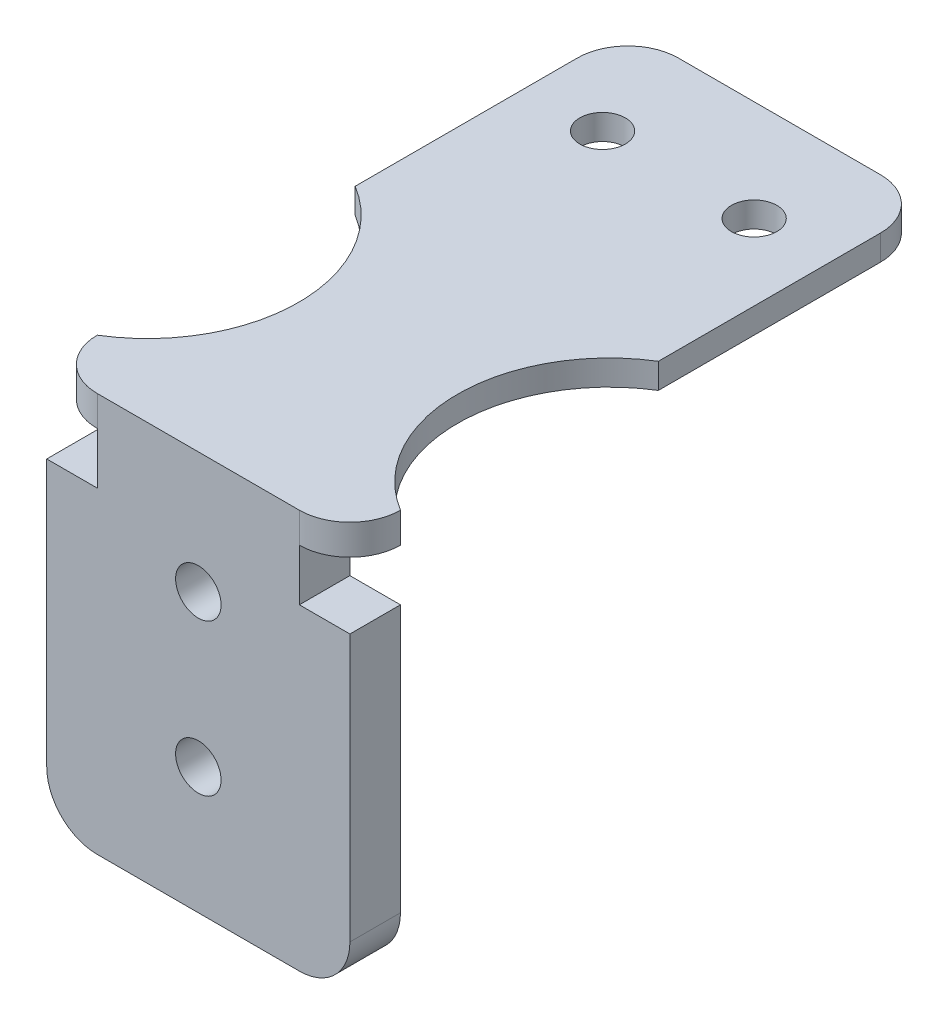
ISO-10303-21;
HEADER;
FILE_DESCRIPTION(('STEP AP214'),'2;1');
FILE_NAME('part.step','',(''),(''),'','','');
FILE_SCHEMA(('AUTOMOTIVE_DESIGN { 1 0 10303 214 1 1 1 1 }'));
ENDSEC;
DATA;
#1=APPLICATION_CONTEXT('core data for automotive mechanical design processes');
#2=APPLICATION_PROTOCOL_DEFINITION('international standard','automotive_design',2000,#1);
#3=PRODUCT_CONTEXT('',#1,'mechanical');
#4=PRODUCT('Part','Part','',(#3));
#5=PRODUCT_RELATED_PRODUCT_CATEGORY('part','',(#4));
#6=PRODUCT_DEFINITION_FORMATION('','',#4);
#7=PRODUCT_DEFINITION_CONTEXT('part definition',#1,'design');
#8=PRODUCT_DEFINITION('design','',#6,#7);
#9=PRODUCT_DEFINITION_SHAPE('','',#8);
#10=(LENGTH_UNIT() NAMED_UNIT(*) SI_UNIT(.MILLI.,.METRE.));
#11=(NAMED_UNIT(*) PLANE_ANGLE_UNIT() SI_UNIT($,.RADIAN.));
#12=(NAMED_UNIT(*) SI_UNIT($,.STERADIAN.) SOLID_ANGLE_UNIT());
#13=UNCERTAINTY_MEASURE_WITH_UNIT(LENGTH_MEASURE(1.E-05),#10,'distance_accuracy_value','');
#14=(GEOMETRIC_REPRESENTATION_CONTEXT(3) GLOBAL_UNCERTAINTY_ASSIGNED_CONTEXT((#13)) GLOBAL_UNIT_ASSIGNED_CONTEXT((#10,
#11,#12)) REPRESENTATION_CONTEXT('',''));
#15=CARTESIAN_POINT('',(0.,0.,0.));
#16=DIRECTION('',(0.,0.,1.));
#17=DIRECTION('',(1.,0.,0.));
#18=AXIS2_PLACEMENT_3D('',#15,#16,#17);
#19=CARTESIAN_POINT('',(-7.84547621701982,-6.78006252951093,16.25));
#20=DIRECTION('',(1.,0.,0.));
#21=DIRECTION('',(0.,0.,-1.));
#22=AXIS2_PLACEMENT_3D('',#19,#20,#21);
#23=PLANE('',#22);
#24=DIRECTION('',(0.,0.888083167154109,-0.459682812619232));
#25=VECTOR('',#24,1.);
#26=CARTESIAN_POINT('',(-7.84547621701982,-2.69769684833897,24.1369171178247));
#27=LINE('',#26,#25);
#28=CARTESIAN_POINT('',(-7.84547621701982,-4.84811479778285,25.25));
#29=VERTEX_POINT('',#28);
#30=CARTESIAN_POINT('',(-7.84547621701982,-3.717189071548,24.6646188803859));
#31=VERTEX_POINT('',#30);
#32=EDGE_CURVE('E211',#29,#31,#27,.T.);
#33=ORIENTED_EDGE('',*,*,#32,.F.);
#34=DIRECTION('',(0.,1.,0.));
#35=VECTOR('',#34,1.);
#36=CARTESIAN_POINT('',(-7.84547621701982,0.,25.25));
#37=LINE('',#36,#35);
#38=CARTESIAN_POINT('',(-7.84547621701982,0.,25.25));
#39=VERTEX_POINT('',#38);
#40=EDGE_CURVE('E440',#29,#39,#37,.T.);
#41=ORIENTED_EDGE('',*,*,#40,.T.);
#42=DIRECTION('',(0.,0.,1.));
#43=VECTOR('',#42,1.);
#44=CARTESIAN_POINT('',(-7.84547621701982,0.,16.25));
#45=LINE('',#44,#43);
#46=CARTESIAN_POINT('',(-7.84547621701982,0.,16.25));
#47=VERTEX_POINT('',#46);
#48=EDGE_CURVE('E231',#47,#39,#45,.T.);
#49=ORIENTED_EDGE('',*,*,#48,.F.);
#50=CARTESIAN_POINT('',(-7.84547621701982,23.9170463435401,31.8437943126175));
#51=DIRECTION('',(1.,0.,0.));
#52=DIRECTION('',(0.,0.,-1.));
#53=AXIS2_PLACEMENT_3D('',#50,#51,#52);
#54=CIRCLE('',#53,28.5515590968912);
#55=EDGE_CURVE('E224',#31,#47,#54,.T.);
#56=ORIENTED_EDGE('',*,*,#55,.F.);
#57=EDGE_LOOP('',(#33,#41,#49,#56));
#58=FACE_BOUND('',#57,.T.);
#59=ADVANCED_FACE('F41',(#58),#23,.F.);
#60=CARTESIAN_POINT('',(7.84547621701982,-6.78006252951093,16.25));
#61=DIRECTION('',(-1.,0.,0.));
#62=DIRECTION('',(0.,0.,1.));
#63=AXIS2_PLACEMENT_3D('',#60,#61,#62);
#64=PLANE('',#63);
#65=DIRECTION('',(0.,0.,1.));
#66=VECTOR('',#65,1.);
#67=CARTESIAN_POINT('',(7.84547621701982,0.,16.25));
#68=LINE('',#67,#66);
#69=CARTESIAN_POINT('',(7.84547621701982,0.,16.25));
#70=VERTEX_POINT('',#69);
#71=CARTESIAN_POINT('',(7.84547621701982,0.,25.25));
#72=VERTEX_POINT('',#71);
#73=EDGE_CURVE('E238',#70,#72,#68,.T.);
#74=ORIENTED_EDGE('',*,*,#73,.T.);
#75=DIRECTION('',(0.,-1.,0.));
#76=VECTOR('',#75,1.);
#77=CARTESIAN_POINT('',(7.84547621701982,-6.78006252951093,25.25));
#78=LINE('',#77,#76);
#79=CARTESIAN_POINT('',(7.84547621701982,-4.84811479778285,25.25));
#80=VERTEX_POINT('',#79);
#81=EDGE_CURVE('E429',#72,#80,#78,.T.);
#82=ORIENTED_EDGE('',*,*,#81,.T.);
#83=DIRECTION('',(0.,-0.888083167154109,0.459682812619232));
#84=VECTOR('',#83,1.);
#85=CARTESIAN_POINT('',(7.84547621701982,-2.69769684833897,24.1369171178247));
#86=LINE('',#85,#84);
#87=CARTESIAN_POINT('',(7.84547621701982,-3.717189071548,24.6646188803859));
#88=VERTEX_POINT('',#87);
#89=EDGE_CURVE('E220',#88,#80,#86,.T.);
#90=ORIENTED_EDGE('',*,*,#89,.F.);
#91=CARTESIAN_POINT('',(7.84547621701982,23.9170463435401,31.8437943126175));
#92=DIRECTION('',(-1.,0.,0.));
#93=DIRECTION('',(0.,0.,1.));
#94=AXIS2_PLACEMENT_3D('',#91,#92,#93);
#95=CIRCLE('',#94,28.5515590968912);
#96=EDGE_CURVE('E227',#70,#88,#95,.T.);
#97=ORIENTED_EDGE('',*,*,#96,.F.);
#98=EDGE_LOOP('',(#74,#82,#90,#97));
#99=FACE_BOUND('',#98,.T.);
#100=ADVANCED_FACE('F514',(#99),#64,.F.);
#101=CARTESIAN_POINT('',(-22.8050965549998,0.,13.4879191185906));
#102=DIRECTION('',(0.,1.,0.));
#103=DIRECTION('',(0.,0.,1.));
#104=AXIS2_PLACEMENT_3D('',#101,#102,#103);
#105=PLANE('',#104);
#106=CARTESIAN_POINT('',(7.50000000000001,0.,-16.25));
#107=DIRECTION('',(0.,1.,0.));
#108=DIRECTION('',(0.,0.,1.));
#109=AXIS2_PLACEMENT_3D('',#106,#107,#108);
#110=CIRCLE('',#109,2.25);
#111=CARTESIAN_POINT('',(7.50000000000001,0.,-14.));
#112=VERTEX_POINT('',#111);
#113=EDGE_CURVE('E360',#112,#112,#110,.T.);
#114=ORIENTED_EDGE('',*,*,#113,.T.);
#115=EDGE_LOOP('',(#114));
#116=FACE_BOUND('',#115,.T.);
#117=CARTESIAN_POINT('',(-7.49999999999999,0.,-16.25));
#118=DIRECTION('',(0.,1.,0.));
#119=DIRECTION('',(0.,0.,1.));
#120=AXIS2_PLACEMENT_3D('',#117,#118,#119);
#121=CIRCLE('',#120,2.25);
#122=CARTESIAN_POINT('',(-7.49999999999999,0.,-14.));
#123=VERTEX_POINT('',#122);
#124=EDGE_CURVE('E364',#123,#123,#121,.T.);
#125=ORIENTED_EDGE('',*,*,#124,.T.);
#126=EDGE_LOOP('',(#125));
#127=FACE_BOUND('',#126,.T.);
#128=DIRECTION('',(1.,0.,0.));
#129=VECTOR('',#128,1.);
#130=CARTESIAN_POINT('',(-15.,0.,26.25));
#131=LINE('',#130,#129);
#132=CARTESIAN_POINT('',(8.84547621701982,0.,26.25));
#133=VERTEX_POINT('',#132);
#134=CARTESIAN_POINT('',(15.,0.,26.25));
#135=VERTEX_POINT('',#134);
#136=EDGE_CURVE('E391',#133,#135,#131,.T.);
#137=ORIENTED_EDGE('',*,*,#136,.F.);
#138=CARTESIAN_POINT('',(8.84547621701982,0.,25.25));
#139=DIRECTION('',(0.,1.,0.));
#140=DIRECTION('',(0.,0.,1.));
#141=AXIS2_PLACEMENT_3D('',#138,#139,#140);
#142=CIRCLE('',#141,1.);
#143=EDGE_CURVE('E438',#133,#72,#142,.F.);
#144=ORIENTED_EDGE('',*,*,#143,.T.);
#145=ORIENTED_EDGE('',*,*,#73,.F.);
#146=DIRECTION('',(1.,0.,0.));
#147=VECTOR('',#146,1.);
#148=CARTESIAN_POINT('',(7.84547621701982,0.,16.25));
#149=LINE('',#148,#147);
#150=EDGE_CURVE('E236',#47,#70,#149,.T.);
#151=ORIENTED_EDGE('',*,*,#150,.F.);
#152=ORIENTED_EDGE('',*,*,#48,.T.);
#153=CARTESIAN_POINT('',(-8.84547621701982,0.,25.25));
#154=DIRECTION('',(0.,1.,0.));
#155=DIRECTION('',(0.,0.,1.));
#156=AXIS2_PLACEMENT_3D('',#153,#154,#155);
#157=CIRCLE('',#156,1.);
#158=CARTESIAN_POINT('',(-8.84547621701982,0.,26.25));
#159=VERTEX_POINT('',#158);
#160=EDGE_CURVE('E62',#39,#159,#157,.F.);
#161=ORIENTED_EDGE('',*,*,#160,.T.);
#162=CARTESIAN_POINT('',(-15.,0.,26.25));
#163=VERTEX_POINT('',#162);
#164=EDGE_CURVE('E392',#163,#159,#131,.T.);
#165=ORIENTED_EDGE('',*,*,#164,.F.);
#166=CARTESIAN_POINT('',(-22.8050965549998,0.,13.4879191185906));
#167=DIRECTION('',(0.,-1.,0.));
#168=DIRECTION('',(0.,0.,1.));
#169=AXIS2_PLACEMENT_3D('',#166,#167,#168);
#170=CIRCLE('',#169,14.95962033798);
#171=CARTESIAN_POINT('',(-15.,0.,0.725838237181253));
#172=VERTEX_POINT('',#171);
#173=EDGE_CURVE('E370',#172,#163,#170,.T.);
#174=ORIENTED_EDGE('',*,*,#173,.F.);
#175=DIRECTION('',(0.,0.,1.));
#176=VECTOR('',#175,1.);
#177=CARTESIAN_POINT('',(-15.,0.,-21.25));
#178=LINE('',#177,#176);
#179=CARTESIAN_POINT('',(-15.,0.,-21.25));
#180=VERTEX_POINT('',#179);
#181=EDGE_CURVE('E377',#180,#172,#178,.T.);
#182=ORIENTED_EDGE('',*,*,#181,.F.);
#183=CARTESIAN_POINT('',(-10.,0.,-21.25));
#184=DIRECTION('',(0.,1.,0.));
#185=DIRECTION('',(0.,0.,-1.));
#186=AXIS2_PLACEMENT_3D('',#183,#184,#185);
#187=CIRCLE('',#186,5.);
#188=CARTESIAN_POINT('',(-10.,0.,-26.25));
#189=VERTEX_POINT('',#188);
#190=EDGE_CURVE('E403',#189,#180,#187,.T.);
#191=ORIENTED_EDGE('',*,*,#190,.F.);
#192=DIRECTION('',(-1.,0.,0.));
#193=VECTOR('',#192,1.);
#194=CARTESIAN_POINT('',(-10.,0.,-26.25));
#195=LINE('',#194,#193);
#196=CARTESIAN_POINT('',(10.,0.,-26.25));
#197=VERTEX_POINT('',#196);
#198=EDGE_CURVE('E401',#197,#189,#195,.T.);
#199=ORIENTED_EDGE('',*,*,#198,.F.);
#200=CARTESIAN_POINT('',(10.,0.,-21.25));
#201=DIRECTION('',(0.,1.,0.));
#202=DIRECTION('',(0.,0.,-1.));
#203=AXIS2_PLACEMENT_3D('',#200,#201,#202);
#204=CIRCLE('',#203,5.);
#205=CARTESIAN_POINT('',(15.,0.,-21.25));
#206=VERTEX_POINT('',#205);
#207=EDGE_CURVE('E399',#206,#197,#204,.T.);
#208=ORIENTED_EDGE('',*,*,#207,.F.);
#209=DIRECTION('',(0.,0.,-1.));
#210=VECTOR('',#209,1.);
#211=CARTESIAN_POINT('',(15.,0.,-21.25));
#212=LINE('',#211,#210);
#213=CARTESIAN_POINT('',(15.,0.,0.725838237181253));
#214=VERTEX_POINT('',#213);
#215=EDGE_CURVE('E397',#214,#206,#212,.T.);
#216=ORIENTED_EDGE('',*,*,#215,.F.);
#217=CARTESIAN_POINT('',(22.8863703515131,0.,13.4879191185906));
#218=DIRECTION('',(0.,-1.,0.));
#219=DIRECTION('',(0.,0.,-1.));
#220=AXIS2_PLACEMENT_3D('',#217,#218,#219);
#221=CIRCLE('',#220,15.002184699065);
#222=EDGE_CURVE('E395',#135,#214,#221,.T.);
#223=ORIENTED_EDGE('',*,*,#222,.F.);
#224=EDGE_LOOP('',(#137,#144,#145,#151,#152,#161,#165,#174,#182,#191,#199,#208,#216,#223));
#225=FACE_BOUND('',#224,.T.);
#226=ADVANCED_FACE('F452',(#116,#127,#225),#105,.F.);
#227=CARTESIAN_POINT('',(0.,0.,26.25));
#228=DIRECTION('',(0.,0.,1.));
#229=DIRECTION('',(1.,0.,0.));
#230=AXIS2_PLACEMENT_3D('',#227,#228,#229);
#231=PLANE('',#230);
#232=CARTESIAN_POINT('',(0.,-9.5,26.25));
#233=DIRECTION('',(0.,0.,1.));
#234=DIRECTION('',(1.,0.,0.));
#235=AXIS2_PLACEMENT_3D('',#232,#233,#234);
#236=CIRCLE('',#235,2.25);
#237=CARTESIAN_POINT('',(2.25,-9.5,26.25));
#238=VERTEX_POINT('',#237);
#239=EDGE_CURVE('E314',#238,#238,#236,.T.);
#240=ORIENTED_EDGE('',*,*,#239,.T.);
#241=EDGE_LOOP('',(#240));
#242=FACE_BOUND('',#241,.T.);
#243=CARTESIAN_POINT('',(0.,-24.5,26.25));
#244=DIRECTION('',(0.,0.,1.));
#245=DIRECTION('',(1.,0.,0.));
#246=AXIS2_PLACEMENT_3D('',#243,#244,#245);
#247=CIRCLE('',#246,2.25);
#248=CARTESIAN_POINT('',(2.25,-24.5,26.25));
#249=VERTEX_POINT('',#248);
#250=EDGE_CURVE('E272',#249,#249,#247,.T.);
#251=ORIENTED_EDGE('',*,*,#250,.T.);
#252=EDGE_LOOP('',(#251));
#253=FACE_BOUND('',#252,.T.);
#254=DIRECTION('',(-1.,0.,0.));
#255=VECTOR('',#254,1.);
#256=CARTESIAN_POINT('',(7.84547621701982,-6.78006252951093,26.25));
#257=LINE('',#256,#255);
#258=CARTESIAN_POINT('',(8.84547621701982,-6.78006252951093,26.25));
#259=VERTEX_POINT('',#258);
#260=CARTESIAN_POINT('',(-8.84547621701982,-6.78006252951093,26.25));
#261=VERTEX_POINT('',#260);
#262=EDGE_CURVE('E219',#259,#261,#257,.T.);
#263=ORIENTED_EDGE('',*,*,#262,.F.);
#264=DIRECTION('',(0.,-1.,0.));
#265=VECTOR('',#264,1.);
#266=CARTESIAN_POINT('',(8.84547621701982,0.,26.25));
#267=LINE('',#266,#265);
#268=EDGE_CURVE('E435',#259,#133,#267,.F.);
#269=ORIENTED_EDGE('',*,*,#268,.T.);
#270=ORIENTED_EDGE('',*,*,#136,.T.);
#271=DIRECTION('',(0.,1.,0.));
#272=VECTOR('',#271,1.);
#273=CARTESIAN_POINT('',(15.,-0.5,26.25));
#274=LINE('',#273,#272);
#275=CARTESIAN_POINT('',(15.,-0.5,26.25));
#276=VERTEX_POINT('',#275);
#277=EDGE_CURVE('E243',#276,#135,#274,.T.);
#278=ORIENTED_EDGE('',*,*,#277,.F.);
#279=DIRECTION('',(-1.,0.,0.));
#280=VECTOR('',#279,1.);
#281=CARTESIAN_POINT('',(9.99999999999999,-0.5,26.25));
#282=LINE('',#281,#280);
#283=CARTESIAN_POINT('',(10.,-0.5,26.25));
#284=VERTEX_POINT('',#283);
#285=EDGE_CURVE('E254',#276,#284,#282,.T.);
#286=ORIENTED_EDGE('',*,*,#285,.T.);
#287=DIRECTION('',(0.,-1.,0.));
#288=VECTOR('',#287,1.);
#289=CARTESIAN_POINT('',(10.,0.,26.25));
#290=LINE('',#289,#288);
#291=CARTESIAN_POINT('',(10.,-5.60759783389856,26.25));
#292=VERTEX_POINT('',#291);
#293=EDGE_CURVE('E333',#284,#292,#290,.T.);
#294=ORIENTED_EDGE('',*,*,#293,.T.);
#295=DIRECTION('',(-1.,0.,0.));
#296=VECTOR('',#295,1.);
#297=CARTESIAN_POINT('',(0.,-5.60759783389856,26.25));
#298=LINE('',#297,#296);
#299=CARTESIAN_POINT('',(15.,-5.60759783389856,26.25));
#300=VERTEX_POINT('',#299);
#301=EDGE_CURVE('E330',#300,#292,#298,.T.);
#302=ORIENTED_EDGE('',*,*,#301,.F.);
#303=DIRECTION('',(0.,-1.,0.));
#304=VECTOR('',#303,1.);
#305=CARTESIAN_POINT('',(15.,0.,26.25));
#306=LINE('',#305,#304);
#307=CARTESIAN_POINT('',(15.,-32.,26.25));
#308=VERTEX_POINT('',#307);
#309=EDGE_CURVE('E328',#300,#308,#306,.T.);
#310=ORIENTED_EDGE('',*,*,#309,.T.);
#311=CARTESIAN_POINT('',(10.,-32.,26.25));
#312=DIRECTION('',(0.,0.,1.));
#313=DIRECTION('',(1.,0.,0.));
#314=AXIS2_PLACEMENT_3D('',#311,#312,#313);
#315=CIRCLE('',#314,5.);
#316=CARTESIAN_POINT('',(9.99999999999997,-37.,26.25));
#317=VERTEX_POINT('',#316);
#318=EDGE_CURVE('E325',#317,#308,#315,.T.);
#319=ORIENTED_EDGE('',*,*,#318,.F.);
#320=DIRECTION('',(1.,0.,0.));
#321=VECTOR('',#320,1.);
#322=CARTESIAN_POINT('',(0.,-37.,26.25));
#323=LINE('',#322,#321);
#324=CARTESIAN_POINT('',(-9.99999999999996,-37.,26.25));
#325=VERTEX_POINT('',#324);
#326=EDGE_CURVE('E322',#325,#317,#323,.T.);
#327=ORIENTED_EDGE('',*,*,#326,.F.);
#328=CARTESIAN_POINT('',(-9.99999999999999,-32.,26.25));
#329=DIRECTION('',(0.,0.,1.));
#330=DIRECTION('',(1.,0.,0.));
#331=AXIS2_PLACEMENT_3D('',#328,#329,#330);
#332=CIRCLE('',#331,5.);
#333=CARTESIAN_POINT('',(-15.,-32.,26.25));
#334=VERTEX_POINT('',#333);
#335=EDGE_CURVE('E319',#334,#325,#332,.T.);
#336=ORIENTED_EDGE('',*,*,#335,.F.);
#337=DIRECTION('',(0.,1.,0.));
#338=VECTOR('',#337,1.);
#339=CARTESIAN_POINT('',(-15.,0.,26.25));
#340=LINE('',#339,#338);
#341=CARTESIAN_POINT('',(-15.,-5.60759783389856,26.25));
#342=VERTEX_POINT('',#341);
#343=EDGE_CURVE('E317',#334,#342,#340,.T.);
#344=ORIENTED_EDGE('',*,*,#343,.T.);
#345=DIRECTION('',(1.,0.,0.));
#346=VECTOR('',#345,1.);
#347=CARTESIAN_POINT('',(0.,-5.60759783389856,26.25));
#348=LINE('',#347,#346);
#349=CARTESIAN_POINT('',(-9.99999999999999,-5.60759783389856,26.25));
#350=VERTEX_POINT('',#349);
#351=EDGE_CURVE('E277',#342,#350,#348,.T.);
#352=ORIENTED_EDGE('',*,*,#351,.T.);
#353=DIRECTION('',(0.,-1.,0.));
#354=VECTOR('',#353,1.);
#355=CARTESIAN_POINT('',(-9.99999999999999,0.,26.25));
#356=LINE('',#355,#354);
#357=CARTESIAN_POINT('',(-9.99999999999999,-0.5,26.25));
#358=VERTEX_POINT('',#357);
#359=EDGE_CURVE('E335',#358,#350,#356,.T.);
#360=ORIENTED_EDGE('',*,*,#359,.F.);
#361=DIRECTION('',(-1.,0.,0.));
#362=VECTOR('',#361,1.);
#363=CARTESIAN_POINT('',(-9.99999999999999,-0.5,26.25));
#364=LINE('',#363,#362);
#365=CARTESIAN_POINT('',(-15.,-0.5,26.25));
#366=VERTEX_POINT('',#365);
#367=EDGE_CURVE('E264',#358,#366,#364,.T.);
#368=ORIENTED_EDGE('',*,*,#367,.T.);
#369=DIRECTION('',(0.,1.,0.));
#370=VECTOR('',#369,1.);
#371=CARTESIAN_POINT('',(-15.,-0.5,26.25));
#372=LINE('',#371,#370);
#373=EDGE_CURVE('E267',#366,#163,#372,.T.);
#374=ORIENTED_EDGE('',*,*,#373,.T.);
#375=ORIENTED_EDGE('',*,*,#164,.T.);
#376=DIRECTION('',(0.,1.,0.));
#377=VECTOR('',#376,1.);
#378=CARTESIAN_POINT('',(-8.84547621701982,-6.78006252951093,26.25));
#379=LINE('',#378,#377);
#380=EDGE_CURVE('E432',#159,#261,#379,.F.);
#381=ORIENTED_EDGE('',*,*,#380,.T.);
#382=EDGE_LOOP('',(#263,#269,#270,#278,#286,#294,#302,#310,#319,#327,#336,#344,#352,#360,#368,
#374,#375,#381));
#383=FACE_BOUND('',#382,.T.);
#384=ADVANCED_FACE('F449',(#242,#253,#383),#231,.F.);
#385=CARTESIAN_POINT('',(10.,0.,31.25));
#386=DIRECTION('',(1.,0.,0.));
#387=DIRECTION('',(0.,0.,-1.));
#388=AXIS2_PLACEMENT_3D('',#385,#386,#387);
#389=PLANE('',#388);
#390=ORIENTED_EDGE('',*,*,#293,.F.);
#391=DIRECTION('',(0.,0.,1.));
#392=VECTOR('',#391,1.);
#393=CARTESIAN_POINT('',(10.,-0.5,31.25));
#394=LINE('',#393,#392);
#395=CARTESIAN_POINT('',(10.,-0.5,31.25));
#396=VERTEX_POINT('',#395);
#397=EDGE_CURVE('E246',#284,#396,#394,.T.);
#398=ORIENTED_EDGE('',*,*,#397,.T.);
#399=DIRECTION('',(0.,-1.,0.));
#400=VECTOR('',#399,1.);
#401=CARTESIAN_POINT('',(10.,0.,31.25));
#402=LINE('',#401,#400);
#403=CARTESIAN_POINT('',(10.,-5.60759783389856,31.25));
#404=VERTEX_POINT('',#403);
#405=EDGE_CURVE('E297',#396,#404,#402,.T.);
#406=ORIENTED_EDGE('',*,*,#405,.T.);
#407=DIRECTION('',(0.,0.,-1.));
#408=VECTOR('',#407,1.);
#409=CARTESIAN_POINT('',(10.,-5.60759783389856,31.25));
#410=LINE('',#409,#408);
#411=EDGE_CURVE('E344',#404,#292,#410,.T.);
#412=ORIENTED_EDGE('',*,*,#411,.T.);
#413=EDGE_LOOP('',(#390,#398,#406,#412));
#414=FACE_BOUND('',#413,.T.);
#415=ADVANCED_FACE('F468',(#414),#389,.T.);
#416=CARTESIAN_POINT('',(-22.8050965549998,2.5,13.4879191185906));
#417=DIRECTION('',(0.,1.,0.));
#418=DIRECTION('',(0.,0.,1.));
#419=AXIS2_PLACEMENT_3D('',#416,#417,#418);
#420=PLANE('',#419);
#421=CARTESIAN_POINT('',(9.99999999999999,2.5,26.25));
#422=DIRECTION('',(0.,1.,0.));
#423=DIRECTION('',(0.,0.,1.));
#424=AXIS2_PLACEMENT_3D('',#421,#422,#423);
#425=CIRCLE('',#424,5.00000000000001);
#426=CARTESIAN_POINT('',(10.,2.5,31.25));
#427=VERTEX_POINT('',#426);
#428=CARTESIAN_POINT('',(15.,2.5,26.25));
#429=VERTEX_POINT('',#428);
#430=EDGE_CURVE('E247',#427,#429,#425,.T.);
#431=ORIENTED_EDGE('',*,*,#430,.T.);
#432=CARTESIAN_POINT('',(22.8863703515131,2.5,13.4879191185906));
#433=DIRECTION('',(0.,-1.,0.));
#434=DIRECTION('',(0.,0.,-1.));
#435=AXIS2_PLACEMENT_3D('',#432,#433,#434);
#436=CIRCLE('',#435,15.002184699065);
#437=CARTESIAN_POINT('',(15.,2.5,0.725838237181253));
#438=VERTEX_POINT('',#437);
#439=EDGE_CURVE('E376',#429,#438,#436,.T.);
#440=ORIENTED_EDGE('',*,*,#439,.T.);
#441=DIRECTION('',(0.,0.,-1.));
#442=VECTOR('',#441,1.);
#443=CARTESIAN_POINT('',(15.,2.5,-21.25));
#444=LINE('',#443,#442);
#445=CARTESIAN_POINT('',(15.,2.5,-21.25));
#446=VERTEX_POINT('',#445);
#447=EDGE_CURVE('E379',#438,#446,#444,.T.);
#448=ORIENTED_EDGE('',*,*,#447,.T.);
#449=CARTESIAN_POINT('',(10.,2.5,-21.25));
#450=DIRECTION('',(0.,1.,0.));
#451=DIRECTION('',(0.,0.,-1.));
#452=AXIS2_PLACEMENT_3D('',#449,#450,#451);
#453=CIRCLE('',#452,5.);
#454=CARTESIAN_POINT('',(10.,2.5,-26.25));
#455=VERTEX_POINT('',#454);
#456=EDGE_CURVE('E381',#446,#455,#453,.T.);
#457=ORIENTED_EDGE('',*,*,#456,.T.);
#458=DIRECTION('',(-1.,0.,0.));
#459=VECTOR('',#458,1.);
#460=CARTESIAN_POINT('',(-10.,2.5,-26.25));
#461=LINE('',#460,#459);
#462=CARTESIAN_POINT('',(-10.,2.5,-26.25));
#463=VERTEX_POINT('',#462);
#464=EDGE_CURVE('E383',#455,#463,#461,.T.);
#465=ORIENTED_EDGE('',*,*,#464,.T.);
#466=CARTESIAN_POINT('',(-10.,2.5,-21.25));
#467=DIRECTION('',(0.,1.,0.));
#468=DIRECTION('',(0.,0.,-1.));
#469=AXIS2_PLACEMENT_3D('',#466,#467,#468);
#470=CIRCLE('',#469,5.);
#471=CARTESIAN_POINT('',(-15.,2.5,-21.25));
#472=VERTEX_POINT('',#471);
#473=EDGE_CURVE('E385',#463,#472,#470,.T.);
#474=ORIENTED_EDGE('',*,*,#473,.T.);
#475=DIRECTION('',(0.,0.,1.));
#476=VECTOR('',#475,1.);
#477=CARTESIAN_POINT('',(-15.,2.5,-21.25));
#478=LINE('',#477,#476);
#479=CARTESIAN_POINT('',(-15.,2.5,0.725838237181253));
#480=VERTEX_POINT('',#479);
#481=EDGE_CURVE('E387',#472,#480,#478,.T.);
#482=ORIENTED_EDGE('',*,*,#481,.T.);
#483=CARTESIAN_POINT('',(-22.8050965549998,2.5,13.4879191185906));
#484=DIRECTION('',(0.,-1.,0.));
#485=DIRECTION('',(0.,0.,1.));
#486=AXIS2_PLACEMENT_3D('',#483,#484,#485);
#487=CIRCLE('',#486,14.95962033798);
#488=CARTESIAN_POINT('',(-15.,2.5,26.25));
#489=VERTEX_POINT('',#488);
#490=EDGE_CURVE('E373',#480,#489,#487,.T.);
#491=ORIENTED_EDGE('',*,*,#490,.T.);
#492=CARTESIAN_POINT('',(-9.99999999999999,2.5,26.25));
#493=DIRECTION('',(0.,1.,0.));
#494=DIRECTION('',(0.,0.,-1.));
#495=AXIS2_PLACEMENT_3D('',#492,#493,#494);
#496=CIRCLE('',#495,5.);
#497=CARTESIAN_POINT('',(-9.99999999999999,2.5,31.25));
#498=VERTEX_POINT('',#497);
#499=EDGE_CURVE('E250',#489,#498,#496,.T.);
#500=ORIENTED_EDGE('',*,*,#499,.T.);
#501=DIRECTION('',(-1.,0.,0.));
#502=VECTOR('',#501,1.);
#503=CARTESIAN_POINT('',(0.,2.5,31.25));
#504=LINE('',#503,#502);
#505=EDGE_CURVE('E301',#427,#498,#504,.T.);
#506=ORIENTED_EDGE('',*,*,#505,.F.);
#507=EDGE_LOOP('',(#431,#440,#448,#457,#465,#474,#482,#491,#500,#506));
#508=FACE_BOUND('',#507,.T.);
#509=CARTESIAN_POINT('',(-7.49999999999999,2.5,-16.25));
#510=DIRECTION('',(0.,1.,0.));
#511=DIRECTION('',(0.,0.,1.));
#512=AXIS2_PLACEMENT_3D('',#509,#510,#511);
#513=CIRCLE('',#512,2.25);
#514=CARTESIAN_POINT('',(-7.49999999999999,2.5,-14.));
#515=VERTEX_POINT('',#514);
#516=EDGE_CURVE('E367',#515,#515,#513,.T.);
#517=ORIENTED_EDGE('',*,*,#516,.F.);
#518=EDGE_LOOP('',(#517));
#519=FACE_BOUND('',#518,.T.);
#520=CARTESIAN_POINT('',(7.50000000000001,2.5,-16.25));
#521=DIRECTION('',(0.,1.,0.));
#522=DIRECTION('',(0.,0.,1.));
#523=AXIS2_PLACEMENT_3D('',#520,#521,#522);
#524=CIRCLE('',#523,2.25);
#525=CARTESIAN_POINT('',(7.50000000000001,2.5,-14.));
#526=VERTEX_POINT('',#525);
#527=EDGE_CURVE('E361',#526,#526,#524,.T.);
#528=ORIENTED_EDGE('',*,*,#527,.F.);
#529=EDGE_LOOP('',(#528));
#530=FACE_BOUND('',#529,.T.);
#531=ADVANCED_FACE('F550',(#508,#519,#530),#420,.T.);
#532=CARTESIAN_POINT('',(-22.8050965549998,2.5,13.4879191185906));
#533=DIRECTION('',(0.,-1.,0.));
#534=DIRECTION('',(0.,0.,-1.));
#535=AXIS2_PLACEMENT_3D('',#532,#533,#534);
#536=CYLINDRICAL_SURFACE('',#535,14.95962033798);
#537=ORIENTED_EDGE('',*,*,#173,.T.);
#538=DIRECTION('',(0.,-1.,0.));
#539=VECTOR('',#538,1.);
#540=CARTESIAN_POINT('',(-15.,2.5,26.25));
#541=LINE('',#540,#539);
#542=EDGE_CURVE('E426',#489,#163,#541,.T.);
#543=ORIENTED_EDGE('',*,*,#542,.F.);
#544=ORIENTED_EDGE('',*,*,#490,.F.);
#545=DIRECTION('',(0.,-1.,0.));
#546=VECTOR('',#545,1.);
#547=CARTESIAN_POINT('',(-15.,2.5,0.725838237181253));
#548=LINE('',#547,#546);
#549=EDGE_CURVE('E389',#480,#172,#548,.T.);
#550=ORIENTED_EDGE('',*,*,#549,.T.);
#551=EDGE_LOOP('',(#537,#543,#544,#550));
#552=FACE_BOUND('',#551,.T.);
#553=ADVANCED_FACE('F579',(#552),#536,.F.);
#554=CARTESIAN_POINT('',(22.8863703515131,2.5,13.4879191185906));
#555=DIRECTION('',(0.,-1.,0.));
#556=DIRECTION('',(0.,0.,-1.));
#557=AXIS2_PLACEMENT_3D('',#554,#555,#556);
#558=CYLINDRICAL_SURFACE('',#557,15.002184699065);
#559=ORIENTED_EDGE('',*,*,#222,.T.);
#560=DIRECTION('',(0.,-1.,0.));
#561=VECTOR('',#560,1.);
#562=CARTESIAN_POINT('',(15.,2.5,0.725838237181253));
#563=LINE('',#562,#561);
#564=EDGE_CURVE('E420',#438,#214,#563,.T.);
#565=ORIENTED_EDGE('',*,*,#564,.F.);
#566=ORIENTED_EDGE('',*,*,#439,.F.);
#567=DIRECTION('',(0.,-1.,0.));
#568=VECTOR('',#567,1.);
#569=CARTESIAN_POINT('',(15.,2.5,26.25));
#570=LINE('',#569,#568);
#571=EDGE_CURVE('E423',#429,#135,#570,.T.);
#572=ORIENTED_EDGE('',*,*,#571,.T.);
#573=EDGE_LOOP('',(#559,#565,#566,#572));
#574=FACE_BOUND('',#573,.T.);
#575=ADVANCED_FACE('F600',(#574),#558,.F.);
#576=CARTESIAN_POINT('',(15.,2.5,-21.25));
#577=DIRECTION('',(-1.,0.,0.));
#578=DIRECTION('',(0.,0.,1.));
#579=AXIS2_PLACEMENT_3D('',#576,#577,#578);
#580=PLANE('',#579);
#581=ORIENTED_EDGE('',*,*,#215,.T.);
#582=DIRECTION('',(0.,-1.,0.));
#583=VECTOR('',#582,1.);
#584=CARTESIAN_POINT('',(15.,2.5,-21.25));
#585=LINE('',#584,#583);
#586=EDGE_CURVE('E417',#446,#206,#585,.T.);
#587=ORIENTED_EDGE('',*,*,#586,.F.);
#588=ORIENTED_EDGE('',*,*,#447,.F.);
#589=ORIENTED_EDGE('',*,*,#564,.T.);
#590=EDGE_LOOP('',(#581,#587,#588,#589));
#591=FACE_BOUND('',#590,.T.);
#592=ADVANCED_FACE('F596',(#591),#580,.F.);
#593=CARTESIAN_POINT('',(10.,2.5,-21.25));
#594=DIRECTION('',(0.,-1.,0.));
#595=DIRECTION('',(0.,0.,-1.));
#596=AXIS2_PLACEMENT_3D('',#593,#594,#595);
#597=CYLINDRICAL_SURFACE('',#596,5.);
#598=ORIENTED_EDGE('',*,*,#207,.T.);
#599=DIRECTION('',(0.,-1.,0.));
#600=VECTOR('',#599,1.);
#601=CARTESIAN_POINT('',(10.,2.5,-26.25));
#602=LINE('',#601,#600);
#603=EDGE_CURVE('E414',#455,#197,#602,.T.);
#604=ORIENTED_EDGE('',*,*,#603,.F.);
#605=ORIENTED_EDGE('',*,*,#456,.F.);
#606=ORIENTED_EDGE('',*,*,#586,.T.);
#607=EDGE_LOOP('',(#598,#604,#605,#606));
#608=FACE_BOUND('',#607,.T.);
#609=ADVANCED_FACE('F592',(#608),#597,.T.);
#610=CARTESIAN_POINT('',(-10.,2.5,-26.25));
#611=DIRECTION('',(0.,0.,1.));
#612=DIRECTION('',(1.,0.,0.));
#613=AXIS2_PLACEMENT_3D('',#610,#611,#612);
#614=PLANE('',#613);
#615=ORIENTED_EDGE('',*,*,#198,.T.);
#616=DIRECTION('',(0.,-1.,0.));
#617=VECTOR('',#616,1.);
#618=CARTESIAN_POINT('',(-10.,2.5,-26.25));
#619=LINE('',#618,#617);
#620=EDGE_CURVE('E411',#463,#189,#619,.T.);
#621=ORIENTED_EDGE('',*,*,#620,.F.);
#622=ORIENTED_EDGE('',*,*,#464,.F.);
#623=ORIENTED_EDGE('',*,*,#603,.T.);
#624=EDGE_LOOP('',(#615,#621,#622,#623));
#625=FACE_BOUND('',#624,.T.);
#626=ADVANCED_FACE('F588',(#625),#614,.F.);
#627=CARTESIAN_POINT('',(-10.,2.5,-21.25));
#628=DIRECTION('',(0.,-1.,0.));
#629=DIRECTION('',(0.,0.,-1.));
#630=AXIS2_PLACEMENT_3D('',#627,#628,#629);
#631=CYLINDRICAL_SURFACE('',#630,5.);
#632=ORIENTED_EDGE('',*,*,#190,.T.);
#633=DIRECTION('',(0.,-1.,0.));
#634=VECTOR('',#633,1.);
#635=CARTESIAN_POINT('',(-15.,2.5,-21.25));
#636=LINE('',#635,#634);
#637=EDGE_CURVE('E408',#472,#180,#636,.T.);
#638=ORIENTED_EDGE('',*,*,#637,.F.);
#639=ORIENTED_EDGE('',*,*,#473,.F.);
#640=ORIENTED_EDGE('',*,*,#620,.T.);
#641=EDGE_LOOP('',(#632,#638,#639,#640));
#642=FACE_BOUND('',#641,.T.);
#643=ADVANCED_FACE('F584',(#642),#631,.T.);
#644=CARTESIAN_POINT('',(-15.,2.5,-21.25));
#645=DIRECTION('',(1.,0.,0.));
#646=DIRECTION('',(0.,0.,-1.));
#647=AXIS2_PLACEMENT_3D('',#644,#645,#646);
#648=PLANE('',#647);
#649=ORIENTED_EDGE('',*,*,#181,.T.);
#650=ORIENTED_EDGE('',*,*,#549,.F.);
#651=ORIENTED_EDGE('',*,*,#481,.F.);
#652=ORIENTED_EDGE('',*,*,#637,.T.);
#653=EDGE_LOOP('',(#649,#650,#651,#652));
#654=FACE_BOUND('',#653,.T.);
#655=ADVANCED_FACE('F576',(#654),#648,.F.);
#656=CARTESIAN_POINT('',(-7.49999999999999,2.5,-16.25));
#657=DIRECTION('',(0.,-1.,0.));
#658=DIRECTION('',(0.,0.,-1.));
#659=AXIS2_PLACEMENT_3D('',#656,#657,#658);
#660=CYLINDRICAL_SURFACE('',#659,2.25);
#661=ORIENTED_EDGE('',*,*,#516,.T.);
#662=EDGE_LOOP('',(#661));
#663=FACE_BOUND('',#662,.T.);
#664=ORIENTED_EDGE('',*,*,#124,.F.);
#665=EDGE_LOOP('',(#664));
#666=FACE_BOUND('',#665,.T.);
#667=ADVANCED_FACE('F572',(#663,#666),#660,.F.);
#668=CARTESIAN_POINT('',(7.50000000000001,2.5,-16.25));
#669=DIRECTION('',(0.,-1.,0.));
#670=DIRECTION('',(0.,0.,-1.));
#671=AXIS2_PLACEMENT_3D('',#668,#669,#670);
#672=CYLINDRICAL_SURFACE('',#671,2.25);
#673=ORIENTED_EDGE('',*,*,#527,.T.);
#674=EDGE_LOOP('',(#673));
#675=FACE_BOUND('',#674,.T.);
#676=ORIENTED_EDGE('',*,*,#113,.F.);
#677=EDGE_LOOP('',(#676));
#678=FACE_BOUND('',#677,.T.);
#679=ADVANCED_FACE('F563',(#675,#678),#672,.F.);
#680=CARTESIAN_POINT('',(-15.,0.,31.25));
#681=DIRECTION('',(-1.,0.,0.));
#682=DIRECTION('',(0.,-1.,0.));
#683=AXIS2_PLACEMENT_3D('',#680,#681,#682);
#684=PLANE('',#683);
#685=ORIENTED_EDGE('',*,*,#343,.F.);
#686=DIRECTION('',(0.,0.,-1.));
#687=VECTOR('',#686,1.);
#688=CARTESIAN_POINT('',(-15.,-32.,31.25));
#689=LINE('',#688,#687);
#690=CARTESIAN_POINT('',(-15.,-32.,31.25));
#691=VERTEX_POINT('',#690);
#692=EDGE_CURVE('E358',#691,#334,#689,.T.);
#693=ORIENTED_EDGE('',*,*,#692,.F.);
#694=DIRECTION('',(0.,1.,0.));
#695=VECTOR('',#694,1.);
#696=CARTESIAN_POINT('',(-15.,0.,31.25));
#697=LINE('',#696,#695);
#698=CARTESIAN_POINT('',(-15.,-5.60759783389856,31.25));
#699=VERTEX_POINT('',#698);
#700=EDGE_CURVE('E280',#691,#699,#697,.T.);
#701=ORIENTED_EDGE('',*,*,#700,.T.);
#702=DIRECTION('',(0.,0.,-1.));
#703=VECTOR('',#702,1.);
#704=CARTESIAN_POINT('',(-15.,-5.60759783389856,31.25));
#705=LINE('',#704,#703);
#706=EDGE_CURVE('E311',#699,#342,#705,.T.);
#707=ORIENTED_EDGE('',*,*,#706,.T.);
#708=EDGE_LOOP('',(#685,#693,#701,#707));
#709=FACE_BOUND('',#708,.T.);
#710=ADVANCED_FACE('F495',(#709),#684,.T.);
#711=CARTESIAN_POINT('',(-9.99999999999999,-32.,31.25));
#712=DIRECTION('',(0.,0.,-1.));
#713=DIRECTION('',(-1.,0.,0.));
#714=AXIS2_PLACEMENT_3D('',#711,#712,#713);
#715=CYLINDRICAL_SURFACE('',#714,5.);
#716=ORIENTED_EDGE('',*,*,#335,.T.);
#717=DIRECTION('',(0.,0.,-1.));
#718=VECTOR('',#717,1.);
#719=CARTESIAN_POINT('',(-9.99999999999996,-37.,31.25));
#720=LINE('',#719,#718);
#721=CARTESIAN_POINT('',(-9.99999999999996,-37.,31.25));
#722=VERTEX_POINT('',#721);
#723=EDGE_CURVE('E355',#722,#325,#720,.T.);
#724=ORIENTED_EDGE('',*,*,#723,.F.);
#725=CARTESIAN_POINT('',(-9.99999999999999,-32.,31.25));
#726=DIRECTION('',(0.,0.,1.));
#727=DIRECTION('',(1.,0.,0.));
#728=AXIS2_PLACEMENT_3D('',#725,#726,#727);
#729=CIRCLE('',#728,5.);
#730=EDGE_CURVE('E283',#691,#722,#729,.T.);
#731=ORIENTED_EDGE('',*,*,#730,.F.);
#732=ORIENTED_EDGE('',*,*,#692,.T.);
#733=EDGE_LOOP('',(#716,#724,#731,#732));
#734=FACE_BOUND('',#733,.T.);
#735=ADVANCED_FACE('F493',(#734),#715,.T.);
#736=CARTESIAN_POINT('',(0.,-37.,31.25));
#737=DIRECTION('',(0.,1.,0.));
#738=DIRECTION('',(0.,0.,1.));
#739=AXIS2_PLACEMENT_3D('',#736,#737,#738);
#740=PLANE('',#739);
#741=ORIENTED_EDGE('',*,*,#326,.T.);
#742=DIRECTION('',(0.,0.,-1.));
#743=VECTOR('',#742,1.);
#744=CARTESIAN_POINT('',(9.99999999999997,-37.,31.25));
#745=LINE('',#744,#743);
#746=CARTESIAN_POINT('',(9.99999999999997,-37.,31.25));
#747=VERTEX_POINT('',#746);
#748=EDGE_CURVE('E352',#747,#317,#745,.T.);
#749=ORIENTED_EDGE('',*,*,#748,.F.);
#750=DIRECTION('',(1.,0.,0.));
#751=VECTOR('',#750,1.);
#752=CARTESIAN_POINT('',(0.,-37.,31.25));
#753=LINE('',#752,#751);
#754=EDGE_CURVE('E286',#722,#747,#753,.T.);
#755=ORIENTED_EDGE('',*,*,#754,.F.);
#756=ORIENTED_EDGE('',*,*,#723,.T.);
#757=EDGE_LOOP('',(#741,#749,#755,#756));
#758=FACE_BOUND('',#757,.T.);
#759=ADVANCED_FACE('F490',(#758),#740,.F.);
#760=CARTESIAN_POINT('',(10.,-32.,31.25));
#761=DIRECTION('',(0.,0.,-1.));
#762=DIRECTION('',(-1.,0.,0.));
#763=AXIS2_PLACEMENT_3D('',#760,#761,#762);
#764=CYLINDRICAL_SURFACE('',#763,5.);
#765=ORIENTED_EDGE('',*,*,#318,.T.);
#766=DIRECTION('',(0.,0.,-1.));
#767=VECTOR('',#766,1.);
#768=CARTESIAN_POINT('',(15.,-32.,31.25));
#769=LINE('',#768,#767);
#770=CARTESIAN_POINT('',(15.,-32.,31.25));
#771=VERTEX_POINT('',#770);
#772=EDGE_CURVE('E349',#771,#308,#769,.T.);
#773=ORIENTED_EDGE('',*,*,#772,.F.);
#774=CARTESIAN_POINT('',(10.,-32.,31.25));
#775=DIRECTION('',(0.,0.,1.));
#776=DIRECTION('',(1.,0.,0.));
#777=AXIS2_PLACEMENT_3D('',#774,#775,#776);
#778=CIRCLE('',#777,5.);
#779=EDGE_CURVE('E289',#747,#771,#778,.T.);
#780=ORIENTED_EDGE('',*,*,#779,.F.);
#781=ORIENTED_EDGE('',*,*,#748,.T.);
#782=EDGE_LOOP('',(#765,#773,#780,#781));
#783=FACE_BOUND('',#782,.T.);
#784=ADVANCED_FACE('F484',(#783),#764,.T.);
#785=CARTESIAN_POINT('',(15.,0.,31.25));
#786=DIRECTION('',(1.,0.,0.));
#787=DIRECTION('',(0.,1.,0.));
#788=AXIS2_PLACEMENT_3D('',#785,#786,#787);
#789=PLANE('',#788);
#790=ORIENTED_EDGE('',*,*,#309,.F.);
#791=DIRECTION('',(0.,0.,-1.));
#792=VECTOR('',#791,1.);
#793=CARTESIAN_POINT('',(15.,-5.60759783389856,31.25));
#794=LINE('',#793,#792);
#795=CARTESIAN_POINT('',(15.,-5.60759783389856,31.25));
#796=VERTEX_POINT('',#795);
#797=EDGE_CURVE('E347',#796,#300,#794,.T.);
#798=ORIENTED_EDGE('',*,*,#797,.F.);
#799=DIRECTION('',(0.,-1.,0.));
#800=VECTOR('',#799,1.);
#801=CARTESIAN_POINT('',(15.,0.,31.25));
#802=LINE('',#801,#800);
#803=EDGE_CURVE('E291',#796,#771,#802,.T.);
#804=ORIENTED_EDGE('',*,*,#803,.T.);
#805=ORIENTED_EDGE('',*,*,#772,.T.);
#806=EDGE_LOOP('',(#790,#798,#804,#805));
#807=FACE_BOUND('',#806,.T.);
#808=ADVANCED_FACE('F481',(#807),#789,.T.);
#809=CARTESIAN_POINT('',(0.,-5.60759783389856,31.25));
#810=DIRECTION('',(0.,-1.,0.));
#811=DIRECTION('',(0.,0.,-1.));
#812=AXIS2_PLACEMENT_3D('',#809,#810,#811);
#813=PLANE('',#812);
#814=ORIENTED_EDGE('',*,*,#301,.T.);
#815=ORIENTED_EDGE('',*,*,#411,.F.);
#816=DIRECTION('',(-1.,0.,0.));
#817=VECTOR('',#816,1.);
#818=CARTESIAN_POINT('',(0.,-5.60759783389856,31.25));
#819=LINE('',#818,#817);
#820=EDGE_CURVE('E294',#796,#404,#819,.T.);
#821=ORIENTED_EDGE('',*,*,#820,.F.);
#822=ORIENTED_EDGE('',*,*,#797,.T.);
#823=EDGE_LOOP('',(#814,#815,#821,#822));
#824=FACE_BOUND('',#823,.T.);
#825=ADVANCED_FACE('F477',(#824),#813,.F.);
#826=CARTESIAN_POINT('',(-9.99999999999999,0.,31.25));
#827=DIRECTION('',(1.,0.,0.));
#828=DIRECTION('',(0.,0.,-1.));
#829=AXIS2_PLACEMENT_3D('',#826,#827,#828);
#830=PLANE('',#829);
#831=DIRECTION('',(0.,-1.,0.));
#832=VECTOR('',#831,1.);
#833=CARTESIAN_POINT('',(-9.99999999999999,0.,31.25));
#834=LINE('',#833,#832);
#835=CARTESIAN_POINT('',(-9.99999999999999,-0.5,31.25));
#836=VERTEX_POINT('',#835);
#837=CARTESIAN_POINT('',(-9.99999999999999,-5.60759783389856,31.25));
#838=VERTEX_POINT('',#837);
#839=EDGE_CURVE('E304',#836,#838,#834,.T.);
#840=ORIENTED_EDGE('',*,*,#839,.F.);
#841=DIRECTION('',(0.,0.,-1.));
#842=VECTOR('',#841,1.);
#843=CARTESIAN_POINT('',(-9.99999999999999,-0.5,31.25));
#844=LINE('',#843,#842);
#845=EDGE_CURVE('E261',#836,#358,#844,.T.);
#846=ORIENTED_EDGE('',*,*,#845,.T.);
#847=ORIENTED_EDGE('',*,*,#359,.T.);
#848=DIRECTION('',(0.,0.,-1.));
#849=VECTOR('',#848,1.);
#850=CARTESIAN_POINT('',(-9.99999999999999,-5.60759783389856,31.25));
#851=LINE('',#850,#849);
#852=EDGE_CURVE('E341',#838,#350,#851,.T.);
#853=ORIENTED_EDGE('',*,*,#852,.F.);
#854=EDGE_LOOP('',(#840,#846,#847,#853));
#855=FACE_BOUND('',#854,.T.);
#856=ADVANCED_FACE('F504',(#855),#830,.F.);
#857=CARTESIAN_POINT('',(0.,-9.5,31.25));
#858=DIRECTION('',(0.,0.,-1.));
#859=DIRECTION('',(-1.,0.,0.));
#860=AXIS2_PLACEMENT_3D('',#857,#858,#859);
#861=CYLINDRICAL_SURFACE('',#860,2.25);
#862=CARTESIAN_POINT('',(0.,-9.5,31.25));
#863=DIRECTION('',(0.,0.,1.));
#864=DIRECTION('',(1.,0.,0.));
#865=AXIS2_PLACEMENT_3D('',#862,#863,#864);
#866=CIRCLE('',#865,2.25);
#867=CARTESIAN_POINT('',(2.25,-9.5,31.25));
#868=VERTEX_POINT('',#867);
#869=EDGE_CURVE('E276',#868,#868,#866,.T.);
#870=ORIENTED_EDGE('',*,*,#869,.T.);
#871=EDGE_LOOP('',(#870));
#872=FACE_BOUND('',#871,.T.);
#873=ORIENTED_EDGE('',*,*,#239,.F.);
#874=EDGE_LOOP('',(#873));
#875=FACE_BOUND('',#874,.T.);
#876=ADVANCED_FACE('F547',(#872,#875),#861,.F.);
#877=CARTESIAN_POINT('',(0.,-24.5,31.25));
#878=DIRECTION('',(0.,0.,-1.));
#879=DIRECTION('',(-1.,0.,0.));
#880=AXIS2_PLACEMENT_3D('',#877,#878,#879);
#881=CYLINDRICAL_SURFACE('',#880,2.25);
#882=CARTESIAN_POINT('',(0.,-24.5,31.25));
#883=DIRECTION('',(0.,0.,1.));
#884=DIRECTION('',(1.,0.,0.));
#885=AXIS2_PLACEMENT_3D('',#882,#883,#884);
#886=CIRCLE('',#885,2.25);
#887=CARTESIAN_POINT('',(2.25,-24.5,31.25));
#888=VERTEX_POINT('',#887);
#889=EDGE_CURVE('E273',#888,#888,#886,.T.);
#890=ORIENTED_EDGE('',*,*,#889,.T.);
#891=EDGE_LOOP('',(#890));
#892=FACE_BOUND('',#891,.T.);
#893=ORIENTED_EDGE('',*,*,#250,.F.);
#894=EDGE_LOOP('',(#893));
#895=FACE_BOUND('',#894,.T.);
#896=ADVANCED_FACE('F544',(#892,#895),#881,.F.);
#897=CARTESIAN_POINT('',(0.,-5.60759783389856,31.25));
#898=DIRECTION('',(0.,1.,0.));
#899=DIRECTION('',(0.,0.,1.));
#900=AXIS2_PLACEMENT_3D('',#897,#898,#899);
#901=PLANE('',#900);
#902=ORIENTED_EDGE('',*,*,#351,.F.);
#903=ORIENTED_EDGE('',*,*,#706,.F.);
#904=DIRECTION('',(1.,0.,0.));
#905=VECTOR('',#904,1.);
#906=CARTESIAN_POINT('',(0.,-5.60759783389856,31.25));
#907=LINE('',#906,#905);
#908=EDGE_CURVE('E308',#699,#838,#907,.T.);
#909=ORIENTED_EDGE('',*,*,#908,.T.);
#910=ORIENTED_EDGE('',*,*,#852,.T.);
#911=EDGE_LOOP('',(#902,#903,#909,#910));
#912=FACE_BOUND('',#911,.T.);
#913=ADVANCED_FACE('F500',(#912),#901,.T.);
#914=CARTESIAN_POINT('',(0.,0.,31.25));
#915=DIRECTION('',(0.,0.,1.));
#916=DIRECTION('',(1.,0.,0.));
#917=AXIS2_PLACEMENT_3D('',#914,#915,#916);
#918=PLANE('',#917);
#919=ORIENTED_EDGE('',*,*,#889,.F.);
#920=EDGE_LOOP('',(#919));
#921=FACE_BOUND('',#920,.T.);
#922=ORIENTED_EDGE('',*,*,#869,.F.);
#923=EDGE_LOOP('',(#922));
#924=FACE_BOUND('',#923,.T.);
#925=ORIENTED_EDGE('',*,*,#700,.F.);
#926=ORIENTED_EDGE('',*,*,#730,.T.);
#927=ORIENTED_EDGE('',*,*,#754,.T.);
#928=ORIENTED_EDGE('',*,*,#779,.T.);
#929=ORIENTED_EDGE('',*,*,#803,.F.);
#930=ORIENTED_EDGE('',*,*,#820,.T.);
#931=ORIENTED_EDGE('',*,*,#405,.F.);
#932=EDGE_CURVE('E298',#427,#396,#402,.T.);
#933=ORIENTED_EDGE('',*,*,#932,.F.);
#934=ORIENTED_EDGE('',*,*,#505,.T.);
#935=EDGE_CURVE('E305',#498,#836,#834,.T.);
#936=ORIENTED_EDGE('',*,*,#935,.T.);
#937=ORIENTED_EDGE('',*,*,#839,.T.);
#938=ORIENTED_EDGE('',*,*,#908,.F.);
#939=EDGE_LOOP('',(#925,#926,#927,#928,#929,#930,#931,#933,#934,#936,#937,#938));
#940=FACE_BOUND('',#939,.T.);
#941=ADVANCED_FACE('F472',(#921,#924,#940),#918,.T.);
#942=CARTESIAN_POINT('',(-9.99999999999999,-0.5,26.25));
#943=DIRECTION('',(0.,1.,0.));
#944=DIRECTION('',(0.,0.,1.));
#945=AXIS2_PLACEMENT_3D('',#942,#943,#944);
#946=CYLINDRICAL_SURFACE('',#945,5.);
#947=ORIENTED_EDGE('',*,*,#499,.F.);
#948=ORIENTED_EDGE('',*,*,#542,.T.);
#949=ORIENTED_EDGE('',*,*,#373,.F.);
#950=CARTESIAN_POINT('',(-9.99999999999999,-0.5,26.25));
#951=DIRECTION('',(0.,1.,0.));
#952=DIRECTION('',(0.,0.,-1.));
#953=AXIS2_PLACEMENT_3D('',#950,#951,#952);
#954=CIRCLE('',#953,5.);
#955=EDGE_CURVE('E259',#366,#836,#954,.T.);
#956=ORIENTED_EDGE('',*,*,#955,.T.);
#957=ORIENTED_EDGE('',*,*,#935,.F.);
#958=EDGE_LOOP('',(#947,#948,#949,#956,#957));
#959=FACE_BOUND('',#958,.T.);
#960=ADVANCED_FACE('F533',(#959),#946,.T.);
#961=CARTESIAN_POINT('',(-9.99999999999999,-0.5,26.25));
#962=DIRECTION('',(0.,-1.,0.));
#963=DIRECTION('',(0.,0.,-1.));
#964=AXIS2_PLACEMENT_3D('',#961,#962,#963);
#965=PLANE('',#964);
#966=ORIENTED_EDGE('',*,*,#955,.F.);
#967=ORIENTED_EDGE('',*,*,#367,.F.);
#968=ORIENTED_EDGE('',*,*,#845,.F.);
#969=EDGE_LOOP('',(#966,#967,#968));
#970=FACE_BOUND('',#969,.T.);
#971=ADVANCED_FACE('F508',(#970),#965,.T.);
#972=CARTESIAN_POINT('',(9.99999999999999,-0.5,26.25));
#973=DIRECTION('',(0.,1.,0.));
#974=DIRECTION('',(0.,0.,1.));
#975=AXIS2_PLACEMENT_3D('',#972,#973,#974);
#976=CYLINDRICAL_SURFACE('',#975,5.00000000000001);
#977=ORIENTED_EDGE('',*,*,#430,.F.);
#978=ORIENTED_EDGE('',*,*,#932,.T.);
#979=CARTESIAN_POINT('',(9.99999999999999,-0.5,26.25));
#980=DIRECTION('',(0.,1.,0.));
#981=DIRECTION('',(0.,0.,1.));
#982=AXIS2_PLACEMENT_3D('',#979,#980,#981);
#983=CIRCLE('',#982,5.00000000000001);
#984=EDGE_CURVE('E251',#396,#276,#983,.T.);
#985=ORIENTED_EDGE('',*,*,#984,.T.);
#986=ORIENTED_EDGE('',*,*,#277,.T.);
#987=ORIENTED_EDGE('',*,*,#571,.F.);
#988=EDGE_LOOP('',(#977,#978,#985,#986,#987));
#989=FACE_BOUND('',#988,.T.);
#990=ADVANCED_FACE('F461',(#989),#976,.T.);
#991=CARTESIAN_POINT('',(9.99999999999999,-0.5,26.25));
#992=DIRECTION('',(0.,1.,0.));
#993=DIRECTION('',(0.,0.,1.));
#994=AXIS2_PLACEMENT_3D('',#991,#992,#993);
#995=PLANE('',#994);
#996=ORIENTED_EDGE('',*,*,#984,.F.);
#997=ORIENTED_EDGE('',*,*,#397,.F.);
#998=ORIENTED_EDGE('',*,*,#285,.F.);
#999=EDGE_LOOP('',(#996,#997,#998));
#1000=FACE_BOUND('',#999,.T.);
#1001=ADVANCED_FACE('F466',(#1000),#995,.F.);
#1002=CARTESIAN_POINT('',(-15.,-6.78006252951093,26.25));
#1003=DIRECTION('',(0.,-0.459682812619232,-0.888083167154108));
#1004=DIRECTION('',(0.,0.888083167154109,-0.459682812619232));
#1005=AXIS2_PLACEMENT_3D('',#1002,#1003,#1004);
#1006=PLANE('',#1005);
#1007=ORIENTED_EDGE('',*,*,#262,.T.);
#1008=CARTESIAN_POINT('',(-8.84547621701982,-4.84811479778285,25.25));
#1009=DIRECTION('',(0.,-0.459682812619232,-0.888083167154108));
#1010=DIRECTION('',(0.,-0.888083167154109,0.459682812619232));
#1011=AXIS2_PLACEMENT_3D('',#1008,#1009,#1010);
#1012=ELLIPSE('',#1011,2.1754130729885,1.);
#1013=EDGE_CURVE('E11',#261,#29,#1012,.F.);
#1014=ORIENTED_EDGE('',*,*,#1013,.T.);
#1015=ORIENTED_EDGE('',*,*,#32,.T.);
#1016=DIRECTION('',(1.,0.,0.));
#1017=VECTOR('',#1016,1.);
#1018=CARTESIAN_POINT('',(-15.,-3.717189071548,24.6646188803859));
#1019=LINE('',#1018,#1017);
#1020=EDGE_CURVE('E215',#31,#88,#1019,.T.);
#1021=ORIENTED_EDGE('',*,*,#1020,.T.);
#1022=ORIENTED_EDGE('',*,*,#89,.T.);
#1023=CARTESIAN_POINT('',(8.84547621701982,-4.84811479778285,25.25));
#1024=DIRECTION('',(0.,-0.459682812619232,-0.888083167154108));
#1025=DIRECTION('',(0.,0.888083167154109,-0.459682812619232));
#1026=AXIS2_PLACEMENT_3D('',#1023,#1024,#1025);
#1027=ELLIPSE('',#1026,2.1754130729885,1.);
#1028=EDGE_CURVE('E49',#80,#259,#1027,.F.);
#1029=ORIENTED_EDGE('',*,*,#1028,.T.);
#1030=EDGE_LOOP('',(#1007,#1014,#1015,#1021,#1022,#1029));
#1031=FACE_BOUND('',#1030,.T.);
#1032=ADVANCED_FACE('F213',(#1031),#1006,.T.);
#1033=CARTESIAN_POINT('',(-15.,23.9170463435401,31.8437943126175));
#1034=DIRECTION('',(1.,0.,0.));
#1035=DIRECTION('',(0.,0.,-1.));
#1036=AXIS2_PLACEMENT_3D('',#1033,#1034,#1035);
#1037=CYLINDRICAL_SURFACE('',#1036,28.5515590968912);
#1038=ORIENTED_EDGE('',*,*,#55,.T.);
#1039=ORIENTED_EDGE('',*,*,#150,.T.);
#1040=ORIENTED_EDGE('',*,*,#96,.T.);
#1041=ORIENTED_EDGE('',*,*,#1020,.F.);
#1042=EDGE_LOOP('',(#1038,#1039,#1040,#1041));
#1043=FACE_BOUND('',#1042,.T.);
#1044=ADVANCED_FACE('F223',(#1043),#1037,.T.);
#1045=CARTESIAN_POINT('',(8.84547621701982,-6.78006252951093,25.25));
#1046=DIRECTION('',(0.,1.,0.));
#1047=DIRECTION('',(0.,0.,1.));
#1048=AXIS2_PLACEMENT_3D('',#1045,#1046,#1047);
#1049=CYLINDRICAL_SURFACE('',#1048,1.);
#1050=ORIENTED_EDGE('',*,*,#143,.F.);
#1051=ORIENTED_EDGE('',*,*,#268,.F.);
#1052=ORIENTED_EDGE('',*,*,#1028,.F.);
#1053=ORIENTED_EDGE('',*,*,#81,.F.);
#1054=EDGE_LOOP('',(#1050,#1051,#1052,#1053));
#1055=FACE_BOUND('',#1054,.T.);
#1056=ADVANCED_FACE('F446',(#1055),#1049,.F.);
#1057=CARTESIAN_POINT('',(-8.84547621701982,-6.78006252951093,25.25));
#1058=DIRECTION('',(0.,-1.,0.));
#1059=DIRECTION('',(0.,0.,-1.));
#1060=AXIS2_PLACEMENT_3D('',#1057,#1058,#1059);
#1061=CYLINDRICAL_SURFACE('',#1060,1.);
#1062=ORIENTED_EDGE('',*,*,#1013,.F.);
#1063=ORIENTED_EDGE('',*,*,#380,.F.);
#1064=ORIENTED_EDGE('',*,*,#160,.F.);
#1065=ORIENTED_EDGE('',*,*,#40,.F.);
#1066=EDGE_LOOP('',(#1062,#1063,#1064,#1065));
#1067=FACE_BOUND('',#1066,.T.);
#1068=ADVANCED_FACE('F43',(#1067),#1061,.F.);
#1069=CLOSED_SHELL('',(#59,#100,#226,#384,#415,#531,#553,#575,#592,#609,#626,#643,#655,#667,
#679,#710,#735,#759,#784,#808,#825,#856,#876,#896,#913,#941,#960,#971,#990,#1001,#1032,#1044,
#1056,#1068));
#1070=MANIFOLD_SOLID_BREP('B2',#1069);
#1071=ADVANCED_BREP_SHAPE_REPRESENTATION('',(#18,#1070),#14);
#1072=SHAPE_DEFINITION_REPRESENTATION(#9,#1071);
ENDSEC;
END-ISO-10303-21;
